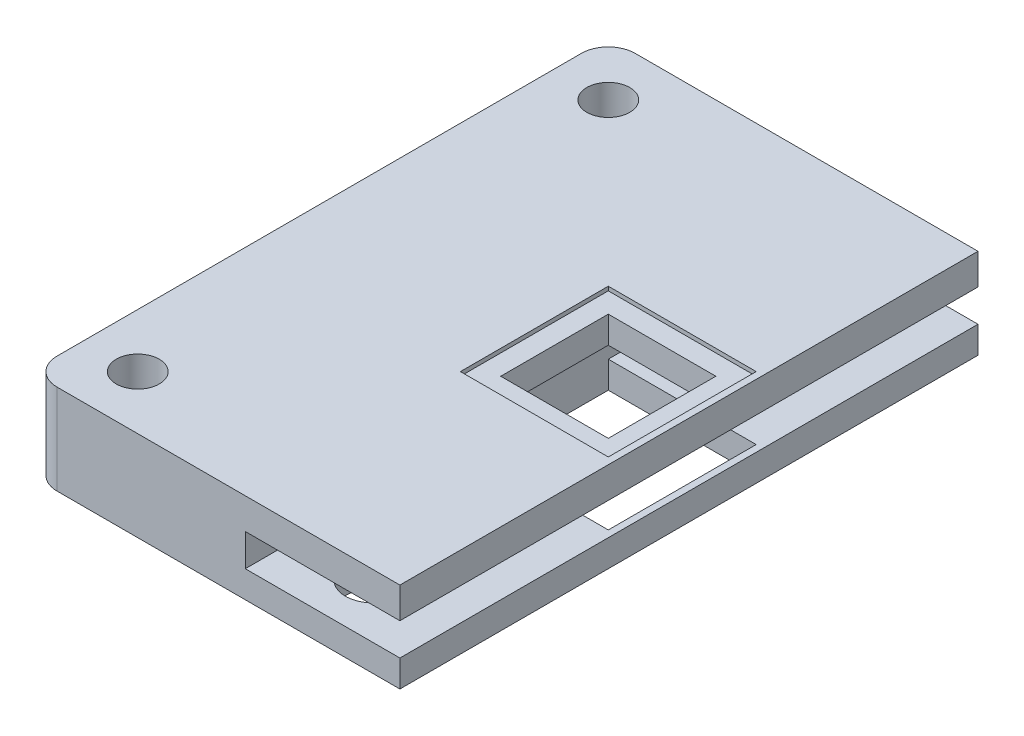
ISO-10303-21;
HEADER;
FILE_DESCRIPTION(('STEP AP214'),'2;1');
FILE_NAME('part.step','',(''),(''),'','','');
FILE_SCHEMA(('AUTOMOTIVE_DESIGN { 1 0 10303 214 1 1 1 1 }'));
ENDSEC;
DATA;
#1=APPLICATION_CONTEXT('core data for automotive mechanical design processes');
#2=APPLICATION_PROTOCOL_DEFINITION('international standard','automotive_design',2000,#1);
#3=PRODUCT_CONTEXT('',#1,'mechanical');
#4=PRODUCT('Part','Part','',(#3));
#5=PRODUCT_RELATED_PRODUCT_CATEGORY('part','',(#4));
#6=PRODUCT_DEFINITION_FORMATION('','',#4);
#7=PRODUCT_DEFINITION_CONTEXT('part definition',#1,'design');
#8=PRODUCT_DEFINITION('design','',#6,#7);
#9=PRODUCT_DEFINITION_SHAPE('','',#8);
#10=(LENGTH_UNIT() NAMED_UNIT(*) SI_UNIT(.MILLI.,.METRE.));
#11=(NAMED_UNIT(*) PLANE_ANGLE_UNIT() SI_UNIT($,.RADIAN.));
#12=(NAMED_UNIT(*) SI_UNIT($,.STERADIAN.) SOLID_ANGLE_UNIT());
#13=UNCERTAINTY_MEASURE_WITH_UNIT(LENGTH_MEASURE(1.E-05),#10,'distance_accuracy_value','');
#14=(GEOMETRIC_REPRESENTATION_CONTEXT(3) GLOBAL_UNCERTAINTY_ASSIGNED_CONTEXT((#13)) GLOBAL_UNIT_ASSIGNED_CONTEXT((#10,
#11,#12)) REPRESENTATION_CONTEXT('',''));
#15=CARTESIAN_POINT('',(0.,0.,0.));
#16=DIRECTION('',(0.,0.,1.));
#17=DIRECTION('',(1.,0.,0.));
#18=AXIS2_PLACEMENT_3D('',#15,#16,#17);
#19=CARTESIAN_POINT('',(-0.933954619124796,0.,-15.7376016731128));
#20=DIRECTION('',(-1.,0.,0.));
#21=DIRECTION('',(0.,0.,1.));
#22=AXIS2_PLACEMENT_3D('',#19,#20,#21);
#23=PLANE('',#22);
#24=DIRECTION('',(0.,-1.,0.));
#25=VECTOR('',#24,1.);
#26=CARTESIAN_POINT('',(-0.933954619124796,3.2,-10.0891410048622));
#27=LINE('',#26,#25);
#28=CARTESIAN_POINT('',(-0.933954619124794,1.,-10.0891410048622));
#29=VERTEX_POINT('',#28);
#30=CARTESIAN_POINT('',(-0.933954619124795,0.,-10.0891410048622));
#31=VERTEX_POINT('',#30);
#32=EDGE_CURVE('E211',#29,#31,#27,.T.);
#33=ORIENTED_EDGE('',*,*,#32,.F.);
#34=DIRECTION('',(0.,0.,-1.));
#35=VECTOR('',#34,1.);
#36=CARTESIAN_POINT('',(-0.933954619124794,1.,11.4108589951378));
#37=LINE('',#36,#35);
#38=CARTESIAN_POINT('',(-0.933954619124792,1.,11.4108589951378));
#39=VERTEX_POINT('',#38);
#40=EDGE_CURVE('E201',#39,#29,#37,.T.);
#41=ORIENTED_EDGE('',*,*,#40,.F.);
#42=DIRECTION('',(0.,1.,0.));
#43=VECTOR('',#42,1.);
#44=CARTESIAN_POINT('',(-0.933954619124792,3.2,11.4108589951378));
#45=LINE('',#44,#43);
#46=CARTESIAN_POINT('',(-0.933954619124792,0.,11.4108589951378));
#47=VERTEX_POINT('',#46);
#48=EDGE_CURVE('E207',#47,#39,#45,.T.);
#49=ORIENTED_EDGE('',*,*,#48,.F.);
#50=DIRECTION('',(0.,0.,1.));
#51=VECTOR('',#50,1.);
#52=CARTESIAN_POINT('',(-0.933954619124796,0.,-15.7376016731128));
#53=LINE('',#52,#51);
#54=EDGE_CURVE('E405',#31,#47,#53,.T.);
#55=ORIENTED_EDGE('',*,*,#54,.F.);
#56=EDGE_LOOP('',(#33,#41,#49,#55));
#57=FACE_BOUND('',#56,.T.);
#58=ADVANCED_FACE('F35',(#57),#23,.F.);
#59=CARTESIAN_POINT('',(0.,0.,0.));
#60=DIRECTION('',(0.,1.,0.));
#61=DIRECTION('',(0.,0.,1.));
#62=AXIS2_PLACEMENT_3D('',#59,#60,#61);
#63=PLANE('',#62);
#64=DIRECTION('',(0.,0.,1.));
#65=VECTOR('',#64,1.);
#66=CARTESIAN_POINT('',(-1.1839546191248,0.,3.41085899513776));
#67=LINE('',#66,#65);
#68=CARTESIAN_POINT('',(-1.1839546191248,0.,-2.08914100486223));
#69=VERTEX_POINT('',#68);
#70=CARTESIAN_POINT('',(-1.1839546191248,0.,3.41085899513776));
#71=VERTEX_POINT('',#70);
#72=EDGE_CURVE('E223',#69,#71,#67,.T.);
#73=ORIENTED_EDGE('',*,*,#72,.F.);
#74=DIRECTION('',(1.,0.,0.));
#75=VECTOR('',#74,1.);
#76=CARTESIAN_POINT('',(-1.1839546191248,0.,-2.08914100486223));
#77=LINE('',#76,#75);
#78=CARTESIAN_POINT('',(-6.6839546191248,0.,-2.08914100486224));
#79=VERTEX_POINT('',#78);
#80=EDGE_CURVE('E220',#79,#69,#77,.T.);
#81=ORIENTED_EDGE('',*,*,#80,.F.);
#82=DIRECTION('',(0.,0.,-1.));
#83=VECTOR('',#82,1.);
#84=CARTESIAN_POINT('',(-6.6839546191248,0.,3.41085899513776));
#85=LINE('',#84,#83);
#86=CARTESIAN_POINT('',(-6.6839546191248,0.,3.41085899513776));
#87=VERTEX_POINT('',#86);
#88=EDGE_CURVE('E217',#87,#79,#85,.T.);
#89=ORIENTED_EDGE('',*,*,#88,.F.);
#90=DIRECTION('',(-1.,0.,0.));
#91=VECTOR('',#90,1.);
#92=CARTESIAN_POINT('',(-1.1839546191248,0.,3.41085899513776));
#93=LINE('',#92,#91);
#94=EDGE_CURVE('E226',#71,#87,#93,.T.);
#95=ORIENTED_EDGE('',*,*,#94,.F.);
#96=EDGE_LOOP('',(#73,#81,#89,#95));
#97=FACE_BOUND('',#96,.T.);
#98=CARTESIAN_POINT('',(-3.9339546191248,0.,-8.08914100486223));
#99=DIRECTION('',(0.,-1.,0.));
#100=DIRECTION('',(0.,0.,-1.));
#101=AXIS2_PLACEMENT_3D('',#98,#99,#100);
#102=CIRCLE('',#101,1.025);
#103=CARTESIAN_POINT('',(-3.9339546191248,0.,-9.11414100486224));
#104=VERTEX_POINT('',#103);
#105=EDGE_CURVE('E239',#104,#104,#102,.T.);
#106=ORIENTED_EDGE('',*,*,#105,.F.);
#107=EDGE_LOOP('',(#106));
#108=FACE_BOUND('',#107,.T.);
#109=CARTESIAN_POINT('',(-3.9339546191248,0.,-4.53914100486224));
#110=DIRECTION('',(0.,-1.,0.));
#111=DIRECTION('',(0.,0.,-1.));
#112=AXIS2_PLACEMENT_3D('',#109,#110,#111);
#113=CIRCLE('',#112,1.025);
#114=CARTESIAN_POINT('',(-3.9339546191248,0.,-5.56414100486224));
#115=VERTEX_POINT('',#114);
#116=EDGE_CURVE('E251',#115,#115,#113,.T.);
#117=ORIENTED_EDGE('',*,*,#116,.F.);
#118=EDGE_LOOP('',(#117));
#119=FACE_BOUND('',#118,.T.);
#120=CARTESIAN_POINT('',(-3.9339546191248,0.,5.86085899513776));
#121=DIRECTION('',(0.,-1.,0.));
#122=DIRECTION('',(0.,0.,-1.));
#123=AXIS2_PLACEMENT_3D('',#120,#121,#122);
#124=CIRCLE('',#123,1.025);
#125=CARTESIAN_POINT('',(-3.9339546191248,0.,4.83585899513776));
#126=VERTEX_POINT('',#125);
#127=EDGE_CURVE('E257',#126,#126,#124,.T.);
#128=ORIENTED_EDGE('',*,*,#127,.F.);
#129=EDGE_LOOP('',(#128));
#130=FACE_BOUND('',#129,.T.);
#131=CARTESIAN_POINT('',(-12.6839546191248,0.,-8.08914100486223));
#132=DIRECTION('',(0.,1.,0.));
#133=DIRECTION('',(0.,0.,1.));
#134=AXIS2_PLACEMENT_3D('',#131,#132,#133);
#135=CIRCLE('',#134,0.799999999999999);
#136=CARTESIAN_POINT('',(-12.6839546191248,0.,-7.28914100486224));
#137=VERTEX_POINT('',#136);
#138=EDGE_CURVE('E266',#137,#137,#135,.T.);
#139=ORIENTED_EDGE('',*,*,#138,.T.);
#140=EDGE_LOOP('',(#139));
#141=FACE_BOUND('',#140,.T.);
#142=CARTESIAN_POINT('',(-12.6839546191248,0.,9.41085899513776));
#143=DIRECTION('',(0.,1.,0.));
#144=DIRECTION('',(0.,0.,1.));
#145=AXIS2_PLACEMENT_3D('',#142,#143,#144);
#146=CIRCLE('',#145,0.799999999999999);
#147=CARTESIAN_POINT('',(-12.6839546191248,0.,10.2108589951378));
#148=VERTEX_POINT('',#147);
#149=EDGE_CURVE('E272',#148,#148,#146,.T.);
#150=ORIENTED_EDGE('',*,*,#149,.T.);
#151=EDGE_LOOP('',(#150));
#152=FACE_BOUND('',#151,.T.);
#153=DIRECTION('',(-1.,0.,0.));
#154=VECTOR('',#153,1.);
#155=CARTESIAN_POINT('',(-14.6839546191248,0.,-10.0891410048622));
#156=LINE('',#155,#154);
#157=CARTESIAN_POINT('',(-13.6839546191248,0.,-10.0891410048622));
#158=VERTEX_POINT('',#157);
#159=EDGE_CURVE('E366',#31,#158,#156,.T.);
#160=ORIENTED_EDGE('',*,*,#159,.F.);
#161=ORIENTED_EDGE('',*,*,#54,.T.);
#162=DIRECTION('',(1.,0.,0.));
#163=VECTOR('',#162,1.);
#164=CARTESIAN_POINT('',(-14.6839546191248,0.,11.4108589951378));
#165=LINE('',#164,#163);
#166=CARTESIAN_POINT('',(-13.6839546191248,0.,11.4108589951378));
#167=VERTEX_POINT('',#166);
#168=EDGE_CURVE('E363',#167,#47,#165,.T.);
#169=ORIENTED_EDGE('',*,*,#168,.F.);
#170=CARTESIAN_POINT('',(-13.6839546191248,0.,10.4108589951378));
#171=DIRECTION('',(0.,1.,0.));
#172=DIRECTION('',(0.,0.,1.));
#173=AXIS2_PLACEMENT_3D('',#170,#171,#172);
#174=CIRCLE('',#173,1.);
#175=CARTESIAN_POINT('',(-14.6839546191248,0.,10.4108589951378));
#176=VERTEX_POINT('',#175);
#177=EDGE_CURVE('E374',#167,#176,#174,.F.);
#178=ORIENTED_EDGE('',*,*,#177,.T.);
#179=DIRECTION('',(0.,0.,1.));
#180=VECTOR('',#179,1.);
#181=CARTESIAN_POINT('',(-14.6839546191248,0.,-10.0891410048622));
#182=LINE('',#181,#180);
#183=CARTESIAN_POINT('',(-14.6839546191248,0.,-9.08914100486223));
#184=VERTEX_POINT('',#183);
#185=EDGE_CURVE('E357',#184,#176,#182,.T.);
#186=ORIENTED_EDGE('',*,*,#185,.F.);
#187=CARTESIAN_POINT('',(-13.6839546191248,0.,-9.08914100486223));
#188=DIRECTION('',(0.,1.,0.));
#189=DIRECTION('',(0.,0.,1.));
#190=AXIS2_PLACEMENT_3D('',#187,#188,#189);
#191=CIRCLE('',#190,1.);
#192=EDGE_CURVE('E371',#184,#158,#191,.F.);
#193=ORIENTED_EDGE('',*,*,#192,.T.);
#194=EDGE_LOOP('',(#160,#161,#169,#178,#186,#193));
#195=FACE_BOUND('',#194,.T.);
#196=CARTESIAN_POINT('',(-3.9339546191248,0.,9.41085899513776));
#197=DIRECTION('',(0.,-1.,0.));
#198=DIRECTION('',(0.,0.,-1.));
#199=AXIS2_PLACEMENT_3D('',#196,#197,#198);
#200=CIRCLE('',#199,1.025);
#201=CARTESIAN_POINT('',(-3.9339546191248,0.,8.38585899513776));
#202=VERTEX_POINT('',#201);
#203=EDGE_CURVE('E245',#202,#202,#200,.T.);
#204=ORIENTED_EDGE('',*,*,#203,.F.);
#205=EDGE_LOOP('',(#204));
#206=FACE_BOUND('',#205,.T.);
#207=ADVANCED_FACE('F395',(#97,#108,#119,#130,#141,#152,#195,#206),#63,.F.);
#208=CARTESIAN_POINT('',(-14.6839546191248,3.2,-10.0891410048622));
#209=DIRECTION('',(1.,0.,0.));
#210=DIRECTION('',(0.,0.,-1.));
#211=AXIS2_PLACEMENT_3D('',#208,#209,#210);
#212=PLANE('',#211);
#213=ORIENTED_EDGE('',*,*,#185,.T.);
#214=DIRECTION('',(0.,-1.,0.));
#215=VECTOR('',#214,1.);
#216=CARTESIAN_POINT('',(-14.6839546191248,3.2,10.4108589951378));
#217=LINE('',#216,#215);
#218=CARTESIAN_POINT('',(-14.6839546191248,3.35,10.4108589951378));
#219=VERTEX_POINT('',#218);
#220=EDGE_CURVE('E379',#176,#219,#217,.F.);
#221=ORIENTED_EDGE('',*,*,#220,.T.);
#222=DIRECTION('',(0.,0.,1.));
#223=VECTOR('',#222,1.);
#224=CARTESIAN_POINT('',(-14.6839546191248,3.35,0.));
#225=LINE('',#224,#223);
#226=CARTESIAN_POINT('',(-14.6839546191248,3.35,-9.08914100486223));
#227=VERTEX_POINT('',#226);
#228=EDGE_CURVE('E310',#227,#219,#225,.T.);
#229=ORIENTED_EDGE('',*,*,#228,.F.);
#230=DIRECTION('',(0.,-1.,0.));
#231=VECTOR('',#230,1.);
#232=CARTESIAN_POINT('',(-14.6839546191248,3.2,-9.08914100486223));
#233=LINE('',#232,#231);
#234=EDGE_CURVE('E376',#227,#184,#233,.T.);
#235=ORIENTED_EDGE('',*,*,#234,.T.);
#236=EDGE_LOOP('',(#213,#221,#229,#235));
#237=FACE_BOUND('',#236,.T.);
#238=ADVANCED_FACE('F399',(#237),#212,.F.);
#239=CARTESIAN_POINT('',(-14.6839546191248,3.2,11.4108589951378));
#240=DIRECTION('',(0.,0.,-1.));
#241=DIRECTION('',(-1.,0.,0.));
#242=AXIS2_PLACEMENT_3D('',#239,#240,#241);
#243=PLANE('',#242);
#244=ORIENTED_EDGE('',*,*,#48,.T.);
#245=DIRECTION('',(1.,0.,0.));
#246=VECTOR('',#245,1.);
#247=CARTESIAN_POINT('',(-6.6839546191248,1.,11.4108589951378));
#248=LINE('',#247,#246);
#249=CARTESIAN_POINT('',(-6.6839546191248,1.,11.4108589951378));
#250=VERTEX_POINT('',#249);
#251=EDGE_CURVE('E50',#250,#39,#248,.T.);
#252=ORIENTED_EDGE('',*,*,#251,.F.);
#253=DIRECTION('',(0.,-1.,0.));
#254=VECTOR('',#253,1.);
#255=CARTESIAN_POINT('',(-6.6839546191248,2.2,11.4108589951378));
#256=LINE('',#255,#254);
#257=CARTESIAN_POINT('',(-6.6839546191248,2.2,11.4108589951378));
#258=VERTEX_POINT('',#257);
#259=EDGE_CURVE('E194',#258,#250,#256,.T.);
#260=ORIENTED_EDGE('',*,*,#259,.F.);
#261=DIRECTION('',(-1.,0.,0.));
#262=VECTOR('',#261,1.);
#263=CARTESIAN_POINT('',(-6.6839546191248,2.2,11.4108589951378));
#264=LINE('',#263,#262);
#265=CARTESIAN_POINT('',(-0.933954619124794,2.2,11.4108589951378));
#266=VERTEX_POINT('',#265);
#267=EDGE_CURVE('E186',#266,#258,#264,.T.);
#268=ORIENTED_EDGE('',*,*,#267,.F.);
#269=CARTESIAN_POINT('',(-0.933954619124792,3.35,11.4108589951378));
#270=VERTEX_POINT('',#269);
#271=EDGE_CURVE('E191',#266,#270,#45,.T.);
#272=ORIENTED_EDGE('',*,*,#271,.T.);
#273=DIRECTION('',(1.,0.,0.));
#274=VECTOR('',#273,1.);
#275=CARTESIAN_POINT('',(0.,3.35,11.4108589951378));
#276=LINE('',#275,#274);
#277=CARTESIAN_POINT('',(-13.6839546191248,3.35,11.4108589951378));
#278=VERTEX_POINT('',#277);
#279=EDGE_CURVE('E314',#278,#270,#276,.T.);
#280=ORIENTED_EDGE('',*,*,#279,.F.);
#281=DIRECTION('',(0.,-1.,0.));
#282=VECTOR('',#281,1.);
#283=CARTESIAN_POINT('',(-13.6839546191248,3.2,11.4108589951378));
#284=LINE('',#283,#282);
#285=EDGE_CURVE('E368',#278,#167,#284,.T.);
#286=ORIENTED_EDGE('',*,*,#285,.T.);
#287=ORIENTED_EDGE('',*,*,#168,.T.);
#288=EDGE_LOOP('',(#244,#252,#260,#268,#272,#280,#286,#287));
#289=FACE_BOUND('',#288,.T.);
#290=ADVANCED_FACE('F188',(#289),#243,.F.);
#291=CARTESIAN_POINT('',(-14.6839546191248,3.2,-10.0891410048622));
#292=DIRECTION('',(0.,0.,1.));
#293=DIRECTION('',(1.,0.,0.));
#294=AXIS2_PLACEMENT_3D('',#291,#292,#293);
#295=PLANE('',#294);
#296=DIRECTION('',(1.,0.,0.));
#297=VECTOR('',#296,1.);
#298=CARTESIAN_POINT('',(-6.6839546191248,1.,-10.0891410048622));
#299=LINE('',#298,#297);
#300=CARTESIAN_POINT('',(-6.6839546191248,1.,-10.0891410048622));
#301=VERTEX_POINT('',#300);
#302=EDGE_CURVE('E349',#301,#29,#299,.T.);
#303=ORIENTED_EDGE('',*,*,#302,.T.);
#304=ORIENTED_EDGE('',*,*,#32,.T.);
#305=ORIENTED_EDGE('',*,*,#159,.T.);
#306=DIRECTION('',(0.,-1.,0.));
#307=VECTOR('',#306,1.);
#308=CARTESIAN_POINT('',(-13.6839546191248,3.2,-10.0891410048622));
#309=LINE('',#308,#307);
#310=CARTESIAN_POINT('',(-13.6839546191248,3.35,-10.0891410048622));
#311=VERTEX_POINT('',#310);
#312=EDGE_CURVE('E11',#158,#311,#309,.F.);
#313=ORIENTED_EDGE('',*,*,#312,.T.);
#314=DIRECTION('',(-1.,0.,0.));
#315=VECTOR('',#314,1.);
#316=CARTESIAN_POINT('',(0.,3.35,-10.0891410048622));
#317=LINE('',#316,#315);
#318=CARTESIAN_POINT('',(-0.933954619124794,3.35,-10.0891410048622));
#319=VERTEX_POINT('',#318);
#320=EDGE_CURVE('E308',#319,#311,#317,.T.);
#321=ORIENTED_EDGE('',*,*,#320,.F.);
#322=CARTESIAN_POINT('',(-0.933954619124796,2.2,-10.0891410048622));
#323=VERTEX_POINT('',#322);
#324=EDGE_CURVE('E208',#319,#323,#27,.T.);
#325=ORIENTED_EDGE('',*,*,#324,.T.);
#326=DIRECTION('',(-1.,0.,0.));
#327=VECTOR('',#326,1.);
#328=CARTESIAN_POINT('',(-6.6839546191248,2.2,-10.0891410048622));
#329=LINE('',#328,#327);
#330=CARTESIAN_POINT('',(-6.6839546191248,2.2,-10.0891410048622));
#331=VERTEX_POINT('',#330);
#332=EDGE_CURVE('E58',#323,#331,#329,.T.);
#333=ORIENTED_EDGE('',*,*,#332,.T.);
#334=DIRECTION('',(0.,-1.,0.));
#335=VECTOR('',#334,1.);
#336=CARTESIAN_POINT('',(-6.6839546191248,2.2,-10.0891410048622));
#337=LINE('',#336,#335);
#338=EDGE_CURVE('E195',#331,#301,#337,.T.);
#339=ORIENTED_EDGE('',*,*,#338,.T.);
#340=EDGE_LOOP('',(#303,#304,#305,#313,#321,#325,#333,#339));
#341=FACE_BOUND('',#340,.T.);
#342=ADVANCED_FACE('F407',(#341),#295,.F.);
#343=CARTESIAN_POINT('',(-6.6839546191248,2.2,-10.0891410048622));
#344=DIRECTION('',(-1.,0.,0.));
#345=DIRECTION('',(0.,0.,1.));
#346=AXIS2_PLACEMENT_3D('',#343,#344,#345);
#347=PLANE('',#346);
#348=ORIENTED_EDGE('',*,*,#259,.T.);
#349=DIRECTION('',(0.,0.,1.));
#350=VECTOR('',#349,1.);
#351=CARTESIAN_POINT('',(-6.6839546191248,1.,-10.0891410048622));
#352=LINE('',#351,#350);
#353=CARTESIAN_POINT('',(-6.6839546191248,1.,3.41085899513776));
#354=VERTEX_POINT('',#353);
#355=EDGE_CURVE('E352',#354,#250,#352,.T.);
#356=ORIENTED_EDGE('',*,*,#355,.F.);
#357=DIRECTION('',(0.,-1.,0.));
#358=VECTOR('',#357,1.);
#359=CARTESIAN_POINT('',(-6.6839546191248,3.351,3.41085899513776));
#360=LINE('',#359,#358);
#361=EDGE_CURVE('E229',#354,#87,#360,.T.);
#362=ORIENTED_EDGE('',*,*,#361,.T.);
#363=ORIENTED_EDGE('',*,*,#88,.T.);
#364=DIRECTION('',(0.,-1.,0.));
#365=VECTOR('',#364,1.);
#366=CARTESIAN_POINT('',(-6.6839546191248,3.351,-2.08914100486224));
#367=LINE('',#366,#365);
#368=CARTESIAN_POINT('',(-6.6839546191248,1.,-2.08914100486224));
#369=VERTEX_POINT('',#368);
#370=EDGE_CURVE('E228',#369,#79,#367,.T.);
#371=ORIENTED_EDGE('',*,*,#370,.F.);
#372=EDGE_CURVE('E358',#301,#369,#352,.T.);
#373=ORIENTED_EDGE('',*,*,#372,.F.);
#374=ORIENTED_EDGE('',*,*,#338,.F.);
#375=DIRECTION('',(0.,0.,1.));
#376=VECTOR('',#375,1.);
#377=CARTESIAN_POINT('',(-6.6839546191248,2.2,-10.0891410048622));
#378=LINE('',#377,#376);
#379=EDGE_CURVE('E355',#331,#258,#378,.T.);
#380=ORIENTED_EDGE('',*,*,#379,.T.);
#381=EDGE_LOOP('',(#348,#356,#362,#363,#371,#373,#374,#380));
#382=FACE_BOUND('',#381,.T.);
#383=ADVANCED_FACE('F431',(#382),#347,.F.);
#384=CARTESIAN_POINT('',(-6.6839546191248,2.2,-10.0891410048622));
#385=DIRECTION('',(0.,1.,0.));
#386=DIRECTION('',(-1.,0.,0.));
#387=AXIS2_PLACEMENT_3D('',#384,#385,#386);
#388=PLANE('',#387);
#389=DIRECTION('',(1.,0.,0.));
#390=VECTOR('',#389,1.);
#391=CARTESIAN_POINT('',(-6.6839546191248,2.2,2.66085899513776));
#392=LINE('',#391,#390);
#393=CARTESIAN_POINT('',(-5.9339546191248,2.2,2.66085899513776));
#394=VERTEX_POINT('',#393);
#395=CARTESIAN_POINT('',(-1.9339546191248,2.2,2.66085899513776));
#396=VERTEX_POINT('',#395);
#397=EDGE_CURVE('E301',#394,#396,#392,.T.);
#398=ORIENTED_EDGE('',*,*,#397,.T.);
#399=DIRECTION('',(0.,0.,-1.));
#400=VECTOR('',#399,1.);
#401=CARTESIAN_POINT('',(-1.9339546191248,2.2,-10.0891410048622));
#402=LINE('',#401,#400);
#403=CARTESIAN_POINT('',(-1.9339546191248,2.2,-1.33914100486224));
#404=VERTEX_POINT('',#403);
#405=EDGE_CURVE('E304',#396,#404,#402,.T.);
#406=ORIENTED_EDGE('',*,*,#405,.T.);
#407=DIRECTION('',(-1.,0.,0.));
#408=VECTOR('',#407,1.);
#409=CARTESIAN_POINT('',(-6.6839546191248,2.2,-1.33914100486224));
#410=LINE('',#409,#408);
#411=CARTESIAN_POINT('',(-5.9339546191248,2.2,-1.33914100486224));
#412=VERTEX_POINT('',#411);
#413=EDGE_CURVE('E289',#404,#412,#410,.T.);
#414=ORIENTED_EDGE('',*,*,#413,.T.);
#415=DIRECTION('',(0.,0.,1.));
#416=VECTOR('',#415,1.);
#417=CARTESIAN_POINT('',(-5.9339546191248,2.2,-10.0891410048622));
#418=LINE('',#417,#416);
#419=EDGE_CURVE('E298',#412,#394,#418,.T.);
#420=ORIENTED_EDGE('',*,*,#419,.T.);
#421=EDGE_LOOP('',(#398,#406,#414,#420));
#422=FACE_BOUND('',#421,.T.);
#423=ORIENTED_EDGE('',*,*,#267,.T.);
#424=ORIENTED_EDGE('',*,*,#379,.F.);
#425=ORIENTED_EDGE('',*,*,#332,.F.);
#426=DIRECTION('',(0.,0.,-1.));
#427=VECTOR('',#426,1.);
#428=CARTESIAN_POINT('',(-0.933954619124794,2.2,11.4108589951378));
#429=LINE('',#428,#427);
#430=EDGE_CURVE('E197',#266,#323,#429,.T.);
#431=ORIENTED_EDGE('',*,*,#430,.F.);
#432=EDGE_LOOP('',(#423,#424,#425,#431));
#433=FACE_BOUND('',#432,.T.);
#434=ADVANCED_FACE('F198',(#422,#433),#388,.F.);
#435=CARTESIAN_POINT('',(-1.1839546191248,2.2,-10.0891410048622));
#436=DIRECTION('',(1.,0.,0.));
#437=DIRECTION('',(0.,0.,-1.));
#438=AXIS2_PLACEMENT_3D('',#435,#436,#437);
#439=PLANE('',#438);
#440=DIRECTION('',(0.,-1.,0.));
#441=VECTOR('',#440,1.);
#442=CARTESIAN_POINT('',(-1.1839546191248,3.351,3.41085899513776));
#443=LINE('',#442,#441);
#444=CARTESIAN_POINT('',(-1.1839546191248,1.,3.41085899513776));
#445=VERTEX_POINT('',#444);
#446=EDGE_CURVE('E233',#445,#71,#443,.T.);
#447=ORIENTED_EDGE('',*,*,#446,.F.);
#448=DIRECTION('',(0.,0.,-1.));
#449=VECTOR('',#448,1.);
#450=CARTESIAN_POINT('',(-1.1839546191248,1.,11.4108589951378));
#451=LINE('',#450,#449);
#452=CARTESIAN_POINT('',(-1.1839546191248,1.,-2.08914100486223));
#453=VERTEX_POINT('',#452);
#454=EDGE_CURVE('E413',#445,#453,#451,.T.);
#455=ORIENTED_EDGE('',*,*,#454,.T.);
#456=DIRECTION('',(0.,-1.,0.));
#457=VECTOR('',#456,1.);
#458=CARTESIAN_POINT('',(-1.1839546191248,3.351,-2.08914100486223));
#459=LINE('',#458,#457);
#460=EDGE_CURVE('E235',#453,#69,#459,.T.);
#461=ORIENTED_EDGE('',*,*,#460,.T.);
#462=ORIENTED_EDGE('',*,*,#72,.T.);
#463=EDGE_LOOP('',(#447,#455,#461,#462));
#464=FACE_BOUND('',#463,.T.);
#465=ADVANCED_FACE('F419',(#464),#439,.F.);
#466=CARTESIAN_POINT('',(-6.6839546191248,1.,-10.0891410048622));
#467=DIRECTION('',(0.,-1.,0.));
#468=DIRECTION('',(0.,0.,-1.));
#469=AXIS2_PLACEMENT_3D('',#466,#467,#468);
#470=PLANE('',#469);
#471=CARTESIAN_POINT('',(-3.9339546191248,1.,9.41085899513776));
#472=DIRECTION('',(0.,-1.,0.));
#473=DIRECTION('',(0.,0.,-1.));
#474=AXIS2_PLACEMENT_3D('',#471,#472,#473);
#475=CIRCLE('',#474,1.025);
#476=CARTESIAN_POINT('',(-3.9339546191248,1.,8.38585899513776));
#477=VERTEX_POINT('',#476);
#478=EDGE_CURVE('E248',#477,#477,#475,.T.);
#479=ORIENTED_EDGE('',*,*,#478,.T.);
#480=EDGE_LOOP('',(#479));
#481=FACE_BOUND('',#480,.T.);
#482=CARTESIAN_POINT('',(-3.9339546191248,1.,5.86085899513776));
#483=DIRECTION('',(0.,-1.,0.));
#484=DIRECTION('',(0.,0.,-1.));
#485=AXIS2_PLACEMENT_3D('',#482,#483,#484);
#486=CIRCLE('',#485,1.025);
#487=CARTESIAN_POINT('',(-3.9339546191248,1.,4.83585899513776));
#488=VERTEX_POINT('',#487);
#489=EDGE_CURVE('E260',#488,#488,#486,.T.);
#490=ORIENTED_EDGE('',*,*,#489,.T.);
#491=EDGE_LOOP('',(#490));
#492=FACE_BOUND('',#491,.T.);
#493=ORIENTED_EDGE('',*,*,#251,.T.);
#494=ORIENTED_EDGE('',*,*,#40,.T.);
#495=ORIENTED_EDGE('',*,*,#302,.F.);
#496=ORIENTED_EDGE('',*,*,#372,.T.);
#497=DIRECTION('',(-1.,0.,0.));
#498=VECTOR('',#497,1.);
#499=CARTESIAN_POINT('',(-1.1839546191248,1.,-2.08914100486223));
#500=LINE('',#499,#498);
#501=EDGE_CURVE('E232',#453,#369,#500,.T.);
#502=ORIENTED_EDGE('',*,*,#501,.F.);
#503=ORIENTED_EDGE('',*,*,#454,.F.);
#504=DIRECTION('',(1.,0.,0.));
#505=VECTOR('',#504,1.);
#506=CARTESIAN_POINT('',(-1.1839546191248,1.,3.41085899513776));
#507=LINE('',#506,#505);
#508=EDGE_CURVE('E210',#354,#445,#507,.T.);
#509=ORIENTED_EDGE('',*,*,#508,.F.);
#510=ORIENTED_EDGE('',*,*,#355,.T.);
#511=EDGE_LOOP('',(#493,#494,#495,#496,#502,#503,#509,#510));
#512=FACE_BOUND('',#511,.T.);
#513=CARTESIAN_POINT('',(-3.9339546191248,1.,-4.53914100486224));
#514=DIRECTION('',(0.,-1.,0.));
#515=DIRECTION('',(0.,0.,-1.));
#516=AXIS2_PLACEMENT_3D('',#513,#514,#515);
#517=CIRCLE('',#516,1.025);
#518=CARTESIAN_POINT('',(-3.9339546191248,1.,-5.56414100486224));
#519=VERTEX_POINT('',#518);
#520=EDGE_CURVE('E254',#519,#519,#517,.T.);
#521=ORIENTED_EDGE('',*,*,#520,.T.);
#522=EDGE_LOOP('',(#521));
#523=FACE_BOUND('',#522,.T.);
#524=CARTESIAN_POINT('',(-3.9339546191248,1.,-8.08914100486223));
#525=DIRECTION('',(0.,-1.,0.));
#526=DIRECTION('',(0.,0.,-1.));
#527=AXIS2_PLACEMENT_3D('',#524,#525,#526);
#528=CIRCLE('',#527,1.025);
#529=CARTESIAN_POINT('',(-3.9339546191248,1.,-9.11414100486224));
#530=VERTEX_POINT('',#529);
#531=EDGE_CURVE('E242',#530,#530,#528,.T.);
#532=ORIENTED_EDGE('',*,*,#531,.T.);
#533=EDGE_LOOP('',(#532));
#534=FACE_BOUND('',#533,.T.);
#535=ADVANCED_FACE('F427',(#481,#492,#512,#523,#534),#470,.F.);
#536=CARTESIAN_POINT('',(0.,3.35,-2.08914100486223));
#537=DIRECTION('',(0.,0.,-1.));
#538=DIRECTION('',(-1.,0.,0.));
#539=AXIS2_PLACEMENT_3D('',#536,#537,#538);
#540=PLANE('',#539);
#541=DIRECTION('',(1.,0.,0.));
#542=VECTOR('',#541,1.);
#543=CARTESIAN_POINT('',(0.,3.2,-2.08914100486223));
#544=LINE('',#543,#542);
#545=CARTESIAN_POINT('',(-6.6839546191248,3.2,-2.08914100486223));
#546=VERTEX_POINT('',#545);
#547=CARTESIAN_POINT('',(-1.1839546191248,3.2,-2.08914100486223));
#548=VERTEX_POINT('',#547);
#549=EDGE_CURVE('E307',#546,#548,#544,.T.);
#550=ORIENTED_EDGE('',*,*,#549,.T.);
#551=DIRECTION('',(0.,-1.,0.));
#552=VECTOR('',#551,1.);
#553=CARTESIAN_POINT('',(-1.1839546191248,3.35,-2.08914100486223));
#554=LINE('',#553,#552);
#555=CARTESIAN_POINT('',(-1.1839546191248,3.35,-2.08914100486223));
#556=VERTEX_POINT('',#555);
#557=EDGE_CURVE('E344',#556,#548,#554,.T.);
#558=ORIENTED_EDGE('',*,*,#557,.F.);
#559=DIRECTION('',(1.,0.,0.));
#560=VECTOR('',#559,1.);
#561=CARTESIAN_POINT('',(0.,3.35,-2.08914100486223));
#562=LINE('',#561,#560);
#563=CARTESIAN_POINT('',(-6.6839546191248,3.35,-2.08914100486223));
#564=VERTEX_POINT('',#563);
#565=EDGE_CURVE('E316',#564,#556,#562,.T.);
#566=ORIENTED_EDGE('',*,*,#565,.F.);
#567=DIRECTION('',(0.,-1.,0.));
#568=VECTOR('',#567,1.);
#569=CARTESIAN_POINT('',(-6.6839546191248,3.35,-2.08914100486223));
#570=LINE('',#569,#568);
#571=EDGE_CURVE('E327',#564,#546,#570,.T.);
#572=ORIENTED_EDGE('',*,*,#571,.T.);
#573=EDGE_LOOP('',(#550,#558,#566,#572));
#574=FACE_BOUND('',#573,.T.);
#575=ADVANCED_FACE('F632',(#574),#540,.F.);
#576=CARTESIAN_POINT('',(-1.1839546191248,3.35,0.));
#577=DIRECTION('',(1.,0.,0.));
#578=DIRECTION('',(0.,0.,-1.));
#579=AXIS2_PLACEMENT_3D('',#576,#577,#578);
#580=PLANE('',#579);
#581=DIRECTION('',(0.,0.,1.));
#582=VECTOR('',#581,1.);
#583=CARTESIAN_POINT('',(-1.1839546191248,3.2,0.));
#584=LINE('',#583,#582);
#585=CARTESIAN_POINT('',(-1.1839546191248,3.2,3.41085899513776));
#586=VERTEX_POINT('',#585);
#587=EDGE_CURVE('E330',#548,#586,#584,.T.);
#588=ORIENTED_EDGE('',*,*,#587,.T.);
#589=DIRECTION('',(0.,-1.,0.));
#590=VECTOR('',#589,1.);
#591=CARTESIAN_POINT('',(-1.1839546191248,3.35,3.41085899513776));
#592=LINE('',#591,#590);
#593=CARTESIAN_POINT('',(-1.1839546191248,3.35,3.41085899513776));
#594=VERTEX_POINT('',#593);
#595=EDGE_CURVE('E341',#594,#586,#592,.T.);
#596=ORIENTED_EDGE('',*,*,#595,.F.);
#597=DIRECTION('',(0.,0.,1.));
#598=VECTOR('',#597,1.);
#599=CARTESIAN_POINT('',(-1.1839546191248,3.35,0.));
#600=LINE('',#599,#598);
#601=EDGE_CURVE('E319',#556,#594,#600,.T.);
#602=ORIENTED_EDGE('',*,*,#601,.F.);
#603=ORIENTED_EDGE('',*,*,#557,.T.);
#604=EDGE_LOOP('',(#588,#596,#602,#603));
#605=FACE_BOUND('',#604,.T.);
#606=ADVANCED_FACE('F622',(#605),#580,.F.);
#607=CARTESIAN_POINT('',(0.,3.35,3.41085899513776));
#608=DIRECTION('',(0.,0.,-1.));
#609=DIRECTION('',(-1.,0.,0.));
#610=AXIS2_PLACEMENT_3D('',#607,#608,#609);
#611=PLANE('',#610);
#612=DIRECTION('',(1.,0.,0.));
#613=VECTOR('',#612,1.);
#614=CARTESIAN_POINT('',(0.,3.2,3.41085899513776));
#615=LINE('',#614,#613);
#616=CARTESIAN_POINT('',(-6.6839546191248,3.2,3.41085899513776));
#617=VERTEX_POINT('',#616);
#618=EDGE_CURVE('E333',#617,#586,#615,.T.);
#619=ORIENTED_EDGE('',*,*,#618,.F.);
#620=DIRECTION('',(0.,-1.,0.));
#621=VECTOR('',#620,1.);
#622=CARTESIAN_POINT('',(-6.6839546191248,3.35,3.41085899513776));
#623=LINE('',#622,#621);
#624=CARTESIAN_POINT('',(-6.6839546191248,3.35,3.41085899513776));
#625=VERTEX_POINT('',#624);
#626=EDGE_CURVE('E338',#625,#617,#623,.T.);
#627=ORIENTED_EDGE('',*,*,#626,.F.);
#628=DIRECTION('',(1.,0.,0.));
#629=VECTOR('',#628,1.);
#630=CARTESIAN_POINT('',(0.,3.35,3.41085899513776));
#631=LINE('',#630,#629);
#632=EDGE_CURVE('E321',#625,#594,#631,.T.);
#633=ORIENTED_EDGE('',*,*,#632,.T.);
#634=ORIENTED_EDGE('',*,*,#595,.T.);
#635=EDGE_LOOP('',(#619,#627,#633,#634));
#636=FACE_BOUND('',#635,.T.);
#637=ADVANCED_FACE('F611',(#636),#611,.T.);
#638=CARTESIAN_POINT('',(-6.6839546191248,3.35,0.));
#639=DIRECTION('',(1.,0.,0.));
#640=DIRECTION('',(0.,0.,-1.));
#641=AXIS2_PLACEMENT_3D('',#638,#639,#640);
#642=PLANE('',#641);
#643=DIRECTION('',(0.,0.,1.));
#644=VECTOR('',#643,1.);
#645=CARTESIAN_POINT('',(-6.6839546191248,3.2,0.));
#646=LINE('',#645,#644);
#647=EDGE_CURVE('E311',#546,#617,#646,.T.);
#648=ORIENTED_EDGE('',*,*,#647,.F.);
#649=ORIENTED_EDGE('',*,*,#571,.F.);
#650=DIRECTION('',(0.,0.,1.));
#651=VECTOR('',#650,1.);
#652=CARTESIAN_POINT('',(-6.6839546191248,3.35,0.));
#653=LINE('',#652,#651);
#654=EDGE_CURVE('E324',#564,#625,#653,.T.);
#655=ORIENTED_EDGE('',*,*,#654,.T.);
#656=ORIENTED_EDGE('',*,*,#626,.T.);
#657=EDGE_LOOP('',(#648,#649,#655,#656));
#658=FACE_BOUND('',#657,.T.);
#659=ADVANCED_FACE('F606',(#658),#642,.T.);
#660=CARTESIAN_POINT('',(0.,3.35,0.));
#661=DIRECTION('',(0.,1.,0.));
#662=DIRECTION('',(0.,0.,1.));
#663=AXIS2_PLACEMENT_3D('',#660,#661,#662);
#664=PLANE('',#663);
#665=DIRECTION('',(0.,0.,1.));
#666=VECTOR('',#665,1.);
#667=CARTESIAN_POINT('',(-0.933954619124796,3.35,-15.7376016731128));
#668=LINE('',#667,#666);
#669=EDGE_CURVE('E205',#319,#270,#668,.T.);
#670=ORIENTED_EDGE('',*,*,#669,.F.);
#671=ORIENTED_EDGE('',*,*,#320,.T.);
#672=CARTESIAN_POINT('',(-13.6839546191248,3.35,-9.08914100486223));
#673=DIRECTION('',(0.,1.,0.));
#674=DIRECTION('',(0.,0.,1.));
#675=AXIS2_PLACEMENT_3D('',#672,#673,#674);
#676=CIRCLE('',#675,1.);
#677=EDGE_CURVE('E381',#311,#227,#676,.T.);
#678=ORIENTED_EDGE('',*,*,#677,.T.);
#679=ORIENTED_EDGE('',*,*,#228,.T.);
#680=CARTESIAN_POINT('',(-13.6839546191248,3.35,10.4108589951378));
#681=DIRECTION('',(0.,1.,0.));
#682=DIRECTION('',(0.,0.,1.));
#683=AXIS2_PLACEMENT_3D('',#680,#681,#682);
#684=CIRCLE('',#683,1.);
#685=EDGE_CURVE('E43',#219,#278,#684,.T.);
#686=ORIENTED_EDGE('',*,*,#685,.T.);
#687=ORIENTED_EDGE('',*,*,#279,.T.);
#688=EDGE_LOOP('',(#670,#671,#678,#679,#686,#687));
#689=FACE_BOUND('',#688,.T.);
#690=CARTESIAN_POINT('',(-12.6839546191248,3.35,-8.08914100486223));
#691=DIRECTION('',(0.,1.,0.));
#692=DIRECTION('',(0.,0.,1.));
#693=AXIS2_PLACEMENT_3D('',#690,#691,#692);
#694=CIRCLE('',#693,0.799999999999988);
#695=CARTESIAN_POINT('',(-12.6839546191248,3.35,-7.28914100486225));
#696=VERTEX_POINT('',#695);
#697=EDGE_CURVE('E263',#696,#696,#694,.T.);
#698=ORIENTED_EDGE('',*,*,#697,.F.);
#699=EDGE_LOOP('',(#698));
#700=FACE_BOUND('',#699,.T.);
#701=CARTESIAN_POINT('',(-12.6839546191248,3.35,9.41085899513776));
#702=DIRECTION('',(0.,1.,0.));
#703=DIRECTION('',(0.,0.,1.));
#704=AXIS2_PLACEMENT_3D('',#701,#702,#703);
#705=CIRCLE('',#704,0.799999999999988);
#706=CARTESIAN_POINT('',(-12.6839546191248,3.35,10.2108589951378));
#707=VERTEX_POINT('',#706);
#708=EDGE_CURVE('E269',#707,#707,#705,.T.);
#709=ORIENTED_EDGE('',*,*,#708,.F.);
#710=EDGE_LOOP('',(#709));
#711=FACE_BOUND('',#710,.T.);
#712=ORIENTED_EDGE('',*,*,#565,.T.);
#713=ORIENTED_EDGE('',*,*,#601,.T.);
#714=ORIENTED_EDGE('',*,*,#632,.F.);
#715=ORIENTED_EDGE('',*,*,#654,.F.);
#716=EDGE_LOOP('',(#712,#713,#714,#715));
#717=FACE_BOUND('',#716,.T.);
#718=ADVANCED_FACE('F384',(#689,#700,#711,#717),#664,.T.);
#719=CARTESIAN_POINT('',(0.,3.2,0.));
#720=DIRECTION('',(0.,1.,0.));
#721=DIRECTION('',(0.,0.,1.));
#722=AXIS2_PLACEMENT_3D('',#719,#720,#721);
#723=PLANE('',#722);
#724=DIRECTION('',(0.,0.,-1.));
#725=VECTOR('',#724,1.);
#726=CARTESIAN_POINT('',(-1.9339546191248,3.2,2.66085899513776));
#727=LINE('',#726,#725);
#728=CARTESIAN_POINT('',(-1.9339546191248,3.2,2.66085899513776));
#729=VERTEX_POINT('',#728);
#730=CARTESIAN_POINT('',(-1.9339546191248,3.2,-1.33914100486224));
#731=VERTEX_POINT('',#730);
#732=EDGE_CURVE('E275',#729,#731,#727,.T.);
#733=ORIENTED_EDGE('',*,*,#732,.F.);
#734=DIRECTION('',(1.,0.,0.));
#735=VECTOR('',#734,1.);
#736=CARTESIAN_POINT('',(-5.9339546191248,3.2,2.66085899513776));
#737=LINE('',#736,#735);
#738=CARTESIAN_POINT('',(-5.9339546191248,3.2,2.66085899513776));
#739=VERTEX_POINT('',#738);
#740=EDGE_CURVE('E283',#739,#729,#737,.T.);
#741=ORIENTED_EDGE('',*,*,#740,.F.);
#742=DIRECTION('',(0.,0.,1.));
#743=VECTOR('',#742,1.);
#744=CARTESIAN_POINT('',(-5.9339546191248,3.2,2.66085899513776));
#745=LINE('',#744,#743);
#746=CARTESIAN_POINT('',(-5.9339546191248,3.2,-1.33914100486224));
#747=VERTEX_POINT('',#746);
#748=EDGE_CURVE('E281',#747,#739,#745,.T.);
#749=ORIENTED_EDGE('',*,*,#748,.F.);
#750=DIRECTION('',(-1.,0.,0.));
#751=VECTOR('',#750,1.);
#752=CARTESIAN_POINT('',(-5.9339546191248,3.2,-1.33914100486224));
#753=LINE('',#752,#751);
#754=EDGE_CURVE('E278',#731,#747,#753,.T.);
#755=ORIENTED_EDGE('',*,*,#754,.F.);
#756=EDGE_LOOP('',(#733,#741,#749,#755));
#757=FACE_BOUND('',#756,.T.);
#758=ORIENTED_EDGE('',*,*,#587,.F.);
#759=ORIENTED_EDGE('',*,*,#549,.F.);
#760=ORIENTED_EDGE('',*,*,#647,.T.);
#761=ORIENTED_EDGE('',*,*,#618,.T.);
#762=EDGE_LOOP('',(#758,#759,#760,#761));
#763=FACE_BOUND('',#762,.T.);
#764=ADVANCED_FACE('F589',(#757,#763),#723,.T.);
#765=CARTESIAN_POINT('',(-1.9339546191248,0.,2.66085899513776));
#766=DIRECTION('',(1.,0.,0.));
#767=DIRECTION('',(0.,0.,-1.));
#768=AXIS2_PLACEMENT_3D('',#765,#766,#767);
#769=PLANE('',#768);
#770=DIRECTION('',(0.,1.,0.));
#771=VECTOR('',#770,1.);
#772=CARTESIAN_POINT('',(-1.9339546191248,0.,2.66085899513776));
#773=LINE('',#772,#771);
#774=EDGE_CURVE('E287',#396,#729,#773,.T.);
#775=ORIENTED_EDGE('',*,*,#774,.T.);
#776=ORIENTED_EDGE('',*,*,#732,.T.);
#777=DIRECTION('',(0.,1.,0.));
#778=VECTOR('',#777,1.);
#779=CARTESIAN_POINT('',(-1.9339546191248,0.,-1.33914100486224));
#780=LINE('',#779,#778);
#781=EDGE_CURVE('E286',#404,#731,#780,.T.);
#782=ORIENTED_EDGE('',*,*,#781,.F.);
#783=ORIENTED_EDGE('',*,*,#405,.F.);
#784=EDGE_LOOP('',(#775,#776,#782,#783));
#785=FACE_BOUND('',#784,.T.);
#786=ADVANCED_FACE('F579',(#785),#769,.F.);
#787=CARTESIAN_POINT('',(-5.9339546191248,0.,2.66085899513776));
#788=DIRECTION('',(0.,0.,1.));
#789=DIRECTION('',(1.,0.,0.));
#790=AXIS2_PLACEMENT_3D('',#787,#788,#789);
#791=PLANE('',#790);
#792=DIRECTION('',(0.,1.,0.));
#793=VECTOR('',#792,1.);
#794=CARTESIAN_POINT('',(-5.9339546191248,0.,2.66085899513776));
#795=LINE('',#794,#793);
#796=EDGE_CURVE('E290',#394,#739,#795,.T.);
#797=ORIENTED_EDGE('',*,*,#796,.T.);
#798=ORIENTED_EDGE('',*,*,#740,.T.);
#799=ORIENTED_EDGE('',*,*,#774,.F.);
#800=ORIENTED_EDGE('',*,*,#397,.F.);
#801=EDGE_LOOP('',(#797,#798,#799,#800));
#802=FACE_BOUND('',#801,.T.);
#803=ADVANCED_FACE('F569',(#802),#791,.F.);
#804=CARTESIAN_POINT('',(-5.9339546191248,0.,2.66085899513776));
#805=DIRECTION('',(-1.,0.,0.));
#806=DIRECTION('',(0.,0.,1.));
#807=AXIS2_PLACEMENT_3D('',#804,#805,#806);
#808=PLANE('',#807);
#809=DIRECTION('',(0.,1.,0.));
#810=VECTOR('',#809,1.);
#811=CARTESIAN_POINT('',(-5.9339546191248,0.,-1.33914100486224));
#812=LINE('',#811,#810);
#813=EDGE_CURVE('E293',#412,#747,#812,.T.);
#814=ORIENTED_EDGE('',*,*,#813,.T.);
#815=ORIENTED_EDGE('',*,*,#748,.T.);
#816=ORIENTED_EDGE('',*,*,#796,.F.);
#817=ORIENTED_EDGE('',*,*,#419,.F.);
#818=EDGE_LOOP('',(#814,#815,#816,#817));
#819=FACE_BOUND('',#818,.T.);
#820=ADVANCED_FACE('F559',(#819),#808,.F.);
#821=CARTESIAN_POINT('',(-5.9339546191248,0.,-1.33914100486224));
#822=DIRECTION('',(0.,0.,-1.));
#823=DIRECTION('',(-1.,0.,0.));
#824=AXIS2_PLACEMENT_3D('',#821,#822,#823);
#825=PLANE('',#824);
#826=ORIENTED_EDGE('',*,*,#781,.T.);
#827=ORIENTED_EDGE('',*,*,#754,.T.);
#828=ORIENTED_EDGE('',*,*,#813,.F.);
#829=ORIENTED_EDGE('',*,*,#413,.F.);
#830=EDGE_LOOP('',(#826,#827,#828,#829));
#831=FACE_BOUND('',#830,.T.);
#832=ADVANCED_FACE('F549',(#831),#825,.F.);
#833=CARTESIAN_POINT('',(-12.6839546191248,3.35,9.41085899513776));
#834=DIRECTION('',(0.,1.,0.));
#835=DIRECTION('',(0.,0.,1.));
#836=AXIS2_PLACEMENT_3D('',#833,#834,#835);
#837=CYLINDRICAL_SURFACE('',#836,0.799999999999993);
#838=ORIENTED_EDGE('',*,*,#149,.F.);
#839=EDGE_LOOP('',(#838));
#840=FACE_BOUND('',#839,.T.);
#841=ORIENTED_EDGE('',*,*,#708,.T.);
#842=EDGE_LOOP('',(#841));
#843=FACE_BOUND('',#842,.T.);
#844=ADVANCED_FACE('F539',(#840,#843),#837,.F.);
#845=CARTESIAN_POINT('',(-12.6839546191248,3.35,-8.08914100486223));
#846=DIRECTION('',(0.,1.,0.));
#847=DIRECTION('',(0.,0.,1.));
#848=AXIS2_PLACEMENT_3D('',#845,#846,#847);
#849=CYLINDRICAL_SURFACE('',#848,0.799999999999993);
#850=ORIENTED_EDGE('',*,*,#138,.F.);
#851=EDGE_LOOP('',(#850));
#852=FACE_BOUND('',#851,.T.);
#853=ORIENTED_EDGE('',*,*,#697,.T.);
#854=EDGE_LOOP('',(#853));
#855=FACE_BOUND('',#854,.T.);
#856=ADVANCED_FACE('F528',(#852,#855),#849,.F.);
#857=CARTESIAN_POINT('',(-3.9339546191248,0.,5.86085899513776));
#858=DIRECTION('',(0.,-1.,0.));
#859=DIRECTION('',(0.,0.,-1.));
#860=AXIS2_PLACEMENT_3D('',#857,#858,#859);
#861=CYLINDRICAL_SURFACE('',#860,1.025);
#862=ORIENTED_EDGE('',*,*,#489,.F.);
#863=EDGE_LOOP('',(#862));
#864=FACE_BOUND('',#863,.T.);
#865=ORIENTED_EDGE('',*,*,#127,.T.);
#866=EDGE_LOOP('',(#865));
#867=FACE_BOUND('',#866,.T.);
#868=ADVANCED_FACE('F518',(#864,#867),#861,.F.);
#869=CARTESIAN_POINT('',(-3.9339546191248,0.,-4.53914100486224));
#870=DIRECTION('',(0.,-1.,0.));
#871=DIRECTION('',(0.,0.,-1.));
#872=AXIS2_PLACEMENT_3D('',#869,#870,#871);
#873=CYLINDRICAL_SURFACE('',#872,1.025);
#874=ORIENTED_EDGE('',*,*,#520,.F.);
#875=EDGE_LOOP('',(#874));
#876=FACE_BOUND('',#875,.T.);
#877=ORIENTED_EDGE('',*,*,#116,.T.);
#878=EDGE_LOOP('',(#877));
#879=FACE_BOUND('',#878,.T.);
#880=ADVANCED_FACE('F508',(#876,#879),#873,.F.);
#881=CARTESIAN_POINT('',(-3.9339546191248,0.,9.41085899513776));
#882=DIRECTION('',(0.,-1.,0.));
#883=DIRECTION('',(0.,0.,-1.));
#884=AXIS2_PLACEMENT_3D('',#881,#882,#883);
#885=CYLINDRICAL_SURFACE('',#884,1.025);
#886=ORIENTED_EDGE('',*,*,#478,.F.);
#887=EDGE_LOOP('',(#886));
#888=FACE_BOUND('',#887,.T.);
#889=ORIENTED_EDGE('',*,*,#203,.T.);
#890=EDGE_LOOP('',(#889));
#891=FACE_BOUND('',#890,.T.);
#892=ADVANCED_FACE('F498',(#888,#891),#885,.F.);
#893=CARTESIAN_POINT('',(-3.9339546191248,0.,-8.08914100486223));
#894=DIRECTION('',(0.,-1.,0.));
#895=DIRECTION('',(0.,0.,-1.));
#896=AXIS2_PLACEMENT_3D('',#893,#894,#895);
#897=CYLINDRICAL_SURFACE('',#896,1.025);
#898=ORIENTED_EDGE('',*,*,#531,.F.);
#899=EDGE_LOOP('',(#898));
#900=FACE_BOUND('',#899,.T.);
#901=ORIENTED_EDGE('',*,*,#105,.T.);
#902=EDGE_LOOP('',(#901));
#903=FACE_BOUND('',#902,.T.);
#904=ADVANCED_FACE('F445',(#900,#903),#897,.F.);
#905=CARTESIAN_POINT('',(-1.1839546191248,3.351,-2.08914100486223));
#906=DIRECTION('',(0.,0.,-1.));
#907=DIRECTION('',(-1.,0.,0.));
#908=AXIS2_PLACEMENT_3D('',#905,#906,#907);
#909=PLANE('',#908);
#910=ORIENTED_EDGE('',*,*,#501,.T.);
#911=ORIENTED_EDGE('',*,*,#370,.T.);
#912=ORIENTED_EDGE('',*,*,#80,.T.);
#913=ORIENTED_EDGE('',*,*,#460,.F.);
#914=EDGE_LOOP('',(#910,#911,#912,#913));
#915=FACE_BOUND('',#914,.T.);
#916=ADVANCED_FACE('F423',(#915),#909,.F.);
#917=CARTESIAN_POINT('',(-1.1839546191248,3.351,3.41085899513776));
#918=DIRECTION('',(0.,0.,1.));
#919=DIRECTION('',(1.,0.,0.));
#920=AXIS2_PLACEMENT_3D('',#917,#918,#919);
#921=PLANE('',#920);
#922=ORIENTED_EDGE('',*,*,#508,.T.);
#923=ORIENTED_EDGE('',*,*,#446,.T.);
#924=ORIENTED_EDGE('',*,*,#94,.T.);
#925=ORIENTED_EDGE('',*,*,#361,.F.);
#926=EDGE_LOOP('',(#922,#923,#924,#925));
#927=FACE_BOUND('',#926,.T.);
#928=ADVANCED_FACE('F438',(#927),#921,.F.);
#929=CARTESIAN_POINT('',(-13.6839546191248,3.2,10.4108589951378));
#930=DIRECTION('',(0.,-1.,0.));
#931=DIRECTION('',(0.,0.,-1.));
#932=AXIS2_PLACEMENT_3D('',#929,#930,#931);
#933=CYLINDRICAL_SURFACE('',#932,1.);
#934=ORIENTED_EDGE('',*,*,#685,.F.);
#935=ORIENTED_EDGE('',*,*,#220,.F.);
#936=ORIENTED_EDGE('',*,*,#177,.F.);
#937=ORIENTED_EDGE('',*,*,#285,.F.);
#938=EDGE_LOOP('',(#934,#935,#936,#937));
#939=FACE_BOUND('',#938,.T.);
#940=ADVANCED_FACE('F391',(#939),#933,.T.);
#941=CARTESIAN_POINT('',(-13.6839546191248,3.2,-9.08914100486223));
#942=DIRECTION('',(0.,-1.,0.));
#943=DIRECTION('',(0.,0.,-1.));
#944=AXIS2_PLACEMENT_3D('',#941,#942,#943);
#945=CYLINDRICAL_SURFACE('',#944,1.);
#946=ORIENTED_EDGE('',*,*,#677,.F.);
#947=ORIENTED_EDGE('',*,*,#312,.F.);
#948=ORIENTED_EDGE('',*,*,#192,.F.);
#949=ORIENTED_EDGE('',*,*,#234,.F.);
#950=EDGE_LOOP('',(#946,#947,#948,#949));
#951=FACE_BOUND('',#950,.T.);
#952=ADVANCED_FACE('F37',(#951),#945,.T.);
#953=ORIENTED_EDGE('',*,*,#271,.F.);
#954=ORIENTED_EDGE('',*,*,#430,.T.);
#955=ORIENTED_EDGE('',*,*,#324,.F.);
#956=ORIENTED_EDGE('',*,*,#669,.T.);
#957=EDGE_LOOP('',(#953,#954,#955,#956));
#958=FACE_BOUND('',#957,.T.);
#959=ADVANCED_FACE('F203',(#958),#23,.F.);
#960=CLOSED_SHELL('',(#58,#207,#238,#290,#342,#383,#434,#465,#535,#575,#606,#637,#659,#718,#764,
#786,#803,#820,#832,#844,#856,#868,#880,#892,#904,#916,#928,#940,#952,#959));
#961=MANIFOLD_SOLID_BREP('B2',#960);
#962=ADVANCED_BREP_SHAPE_REPRESENTATION('',(#18,#961),#14);
#963=SHAPE_DEFINITION_REPRESENTATION(#9,#962);
ENDSEC;
END-ISO-10303-21;
